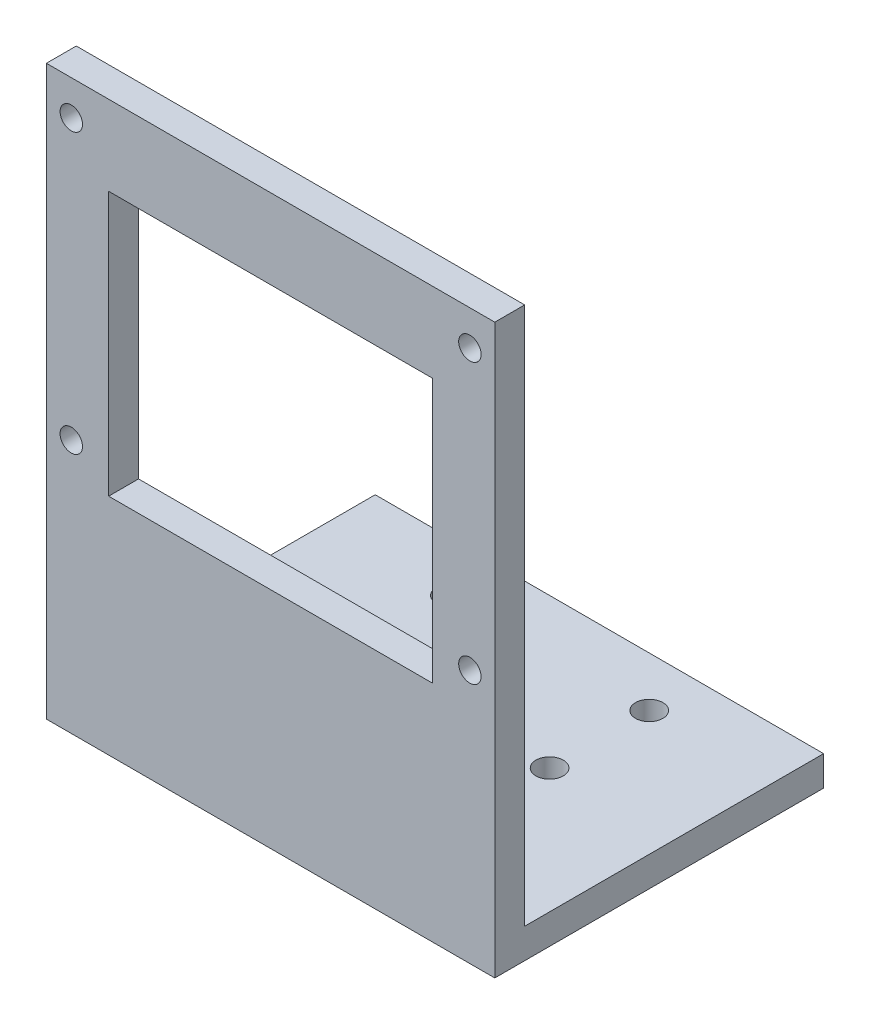
ISO-10303-21;
HEADER;
FILE_DESCRIPTION(('STEP AP214'),'2;1');
FILE_NAME('part.step','',(''),(''),'','','');
FILE_SCHEMA(('AUTOMOTIVE_DESIGN { 1 0 10303 214 1 1 1 1 }'));
ENDSEC;
DATA;
#1=APPLICATION_CONTEXT('core data for automotive mechanical design processes');
#2=APPLICATION_PROTOCOL_DEFINITION('international standard','automotive_design',2000,#1);
#3=PRODUCT_CONTEXT('',#1,'mechanical');
#4=PRODUCT('Part','Part','',(#3));
#5=PRODUCT_RELATED_PRODUCT_CATEGORY('part','',(#4));
#6=PRODUCT_DEFINITION_FORMATION('','',#4);
#7=PRODUCT_DEFINITION_CONTEXT('part definition',#1,'design');
#8=PRODUCT_DEFINITION('design','',#6,#7);
#9=PRODUCT_DEFINITION_SHAPE('','',#8);
#10=(LENGTH_UNIT() NAMED_UNIT(*) SI_UNIT(.MILLI.,.METRE.));
#11=(NAMED_UNIT(*) PLANE_ANGLE_UNIT() SI_UNIT($,.RADIAN.));
#12=(NAMED_UNIT(*) SI_UNIT($,.STERADIAN.) SOLID_ANGLE_UNIT());
#13=UNCERTAINTY_MEASURE_WITH_UNIT(LENGTH_MEASURE(1.E-05),#10,'distance_accuracy_value','');
#14=(GEOMETRIC_REPRESENTATION_CONTEXT(3) GLOBAL_UNCERTAINTY_ASSIGNED_CONTEXT((#13)) GLOBAL_UNIT_ASSIGNED_CONTEXT((#10,
#11,#12)) REPRESENTATION_CONTEXT('',''));
#15=CARTESIAN_POINT('',(0.,0.,0.));
#16=DIRECTION('',(0.,0.,1.));
#17=DIRECTION('',(1.,0.,0.));
#18=AXIS2_PLACEMENT_3D('',#15,#16,#17);
#19=CARTESIAN_POINT('',(25.,0.001899999999978,10.));
#20=DIRECTION('',(0.,1.,0.));
#21=DIRECTION('',(0.,0.,1.));
#22=AXIS2_PLACEMENT_3D('',#19,#20,#21);
#23=CYLINDRICAL_SURFACE('',#22,2.75);
#24=CARTESIAN_POINT('',(25.,0.001899999999978,10.));
#25=DIRECTION('',(0.,1.,0.));
#26=DIRECTION('',(0.,0.,1.));
#27=AXIS2_PLACEMENT_3D('',#24,#25,#26);
#28=CIRCLE('',#27,2.75);
#29=CARTESIAN_POINT('',(25.,0.001899999999978,12.75));
#30=VERTEX_POINT('',#29);
#31=EDGE_CURVE('E120',#30,#30,#28,.F.);
#32=ORIENTED_EDGE('',*,*,#31,.T.);
#33=EDGE_LOOP('',(#32));
#34=FACE_BOUND('',#33,.T.);
#35=CARTESIAN_POINT('',(25.,6.0019,10.));
#36=DIRECTION('',(0.,1.,0.));
#37=DIRECTION('',(0.,0.,1.));
#38=AXIS2_PLACEMENT_3D('',#35,#36,#37);
#39=CIRCLE('',#38,2.75);
#40=CARTESIAN_POINT('',(25.,6.0019,12.75));
#41=VERTEX_POINT('',#40);
#42=EDGE_CURVE('E19',#41,#41,#39,.F.);
#43=ORIENTED_EDGE('',*,*,#42,.F.);
#44=EDGE_LOOP('',(#43));
#45=FACE_BOUND('',#44,.T.);
#46=ADVANCED_FACE('F16',(#34,#45),#23,.F.);
#47=CARTESIAN_POINT('',(25.,0.001899999999978,30.));
#48=DIRECTION('',(0.,1.,0.));
#49=DIRECTION('',(0.,0.,1.));
#50=AXIS2_PLACEMENT_3D('',#47,#48,#49);
#51=CYLINDRICAL_SURFACE('',#50,2.75);
#52=CARTESIAN_POINT('',(25.,0.001899999999978,30.));
#53=DIRECTION('',(0.,1.,0.));
#54=DIRECTION('',(0.,0.,1.));
#55=AXIS2_PLACEMENT_3D('',#52,#53,#54);
#56=CIRCLE('',#55,2.75);
#57=CARTESIAN_POINT('',(25.,0.001899999999978,32.75));
#58=VERTEX_POINT('',#57);
#59=EDGE_CURVE('E155',#58,#58,#56,.F.);
#60=ORIENTED_EDGE('',*,*,#59,.T.);
#61=EDGE_LOOP('',(#60));
#62=FACE_BOUND('',#61,.T.);
#63=CARTESIAN_POINT('',(25.,6.0019,30.));
#64=DIRECTION('',(0.,1.,0.));
#65=DIRECTION('',(0.,0.,1.));
#66=AXIS2_PLACEMENT_3D('',#63,#64,#65);
#67=CIRCLE('',#66,2.75);
#68=CARTESIAN_POINT('',(25.,6.0019,32.75));
#69=VERTEX_POINT('',#68);
#70=EDGE_CURVE('E164',#69,#69,#67,.F.);
#71=ORIENTED_EDGE('',*,*,#70,.F.);
#72=EDGE_LOOP('',(#71));
#73=FACE_BOUND('',#72,.T.);
#74=ADVANCED_FACE('F173',(#62,#73),#51,.F.);
#75=CARTESIAN_POINT('',(65.,0.001899999999978,10.));
#76=DIRECTION('',(0.,1.,0.));
#77=DIRECTION('',(0.,0.,1.));
#78=AXIS2_PLACEMENT_3D('',#75,#76,#77);
#79=CYLINDRICAL_SURFACE('',#78,2.75);
#80=CARTESIAN_POINT('',(65.,0.001899999999978,10.));
#81=DIRECTION('',(0.,1.,0.));
#82=DIRECTION('',(0.,0.,1.));
#83=AXIS2_PLACEMENT_3D('',#80,#81,#82);
#84=CIRCLE('',#83,2.75);
#85=CARTESIAN_POINT('',(65.,0.001899999999978,12.75));
#86=VERTEX_POINT('',#85);
#87=EDGE_CURVE('E152',#86,#86,#84,.F.);
#88=ORIENTED_EDGE('',*,*,#87,.T.);
#89=EDGE_LOOP('',(#88));
#90=FACE_BOUND('',#89,.T.);
#91=CARTESIAN_POINT('',(65.,6.0019,10.));
#92=DIRECTION('',(0.,1.,0.));
#93=DIRECTION('',(0.,0.,1.));
#94=AXIS2_PLACEMENT_3D('',#91,#92,#93);
#95=CIRCLE('',#94,2.75);
#96=CARTESIAN_POINT('',(65.,6.0019,12.75));
#97=VERTEX_POINT('',#96);
#98=EDGE_CURVE('E162',#97,#97,#95,.F.);
#99=ORIENTED_EDGE('',*,*,#98,.F.);
#100=EDGE_LOOP('',(#99));
#101=FACE_BOUND('',#100,.T.);
#102=ADVANCED_FACE('F179',(#90,#101),#79,.F.);
#103=CARTESIAN_POINT('',(65.,0.001899999999978,30.));
#104=DIRECTION('',(0.,1.,0.));
#105=DIRECTION('',(0.,0.,1.));
#106=AXIS2_PLACEMENT_3D('',#103,#104,#105);
#107=CYLINDRICAL_SURFACE('',#106,2.75);
#108=CARTESIAN_POINT('',(65.,0.001899999999978,30.));
#109=DIRECTION('',(0.,1.,0.));
#110=DIRECTION('',(0.,0.,1.));
#111=AXIS2_PLACEMENT_3D('',#108,#109,#110);
#112=CIRCLE('',#111,2.75);
#113=CARTESIAN_POINT('',(65.,0.001899999999978,32.75));
#114=VERTEX_POINT('',#113);
#115=EDGE_CURVE('E148',#114,#114,#112,.F.);
#116=ORIENTED_EDGE('',*,*,#115,.T.);
#117=EDGE_LOOP('',(#116));
#118=FACE_BOUND('',#117,.T.);
#119=CARTESIAN_POINT('',(65.,6.0019,30.));
#120=DIRECTION('',(0.,1.,0.));
#121=DIRECTION('',(0.,0.,1.));
#122=AXIS2_PLACEMENT_3D('',#119,#120,#121);
#123=CIRCLE('',#122,2.75);
#124=CARTESIAN_POINT('',(65.,6.0019,32.75));
#125=VERTEX_POINT('',#124);
#126=EDGE_CURVE('E106',#125,#125,#123,.F.);
#127=ORIENTED_EDGE('',*,*,#126,.F.);
#128=EDGE_LOOP('',(#127));
#129=FACE_BOUND('',#128,.T.);
#130=ADVANCED_FACE('F258',(#118,#129),#107,.F.);
#131=CARTESIAN_POINT('',(0.,0.001899999999978,0.));
#132=DIRECTION('',(0.,0.,1.));
#133=DIRECTION('',(1.,0.,0.));
#134=AXIS2_PLACEMENT_3D('',#131,#132,#133);
#135=PLANE('',#134);
#136=DIRECTION('',(0.,1.,0.));
#137=VECTOR('',#136,1.);
#138=CARTESIAN_POINT('',(90.,0.001899999999978,0.));
#139=LINE('',#138,#137);
#140=CARTESIAN_POINT('',(90.,0.001899999999978,0.));
#141=VERTEX_POINT('',#140);
#142=CARTESIAN_POINT('',(90.,6.0019,0.));
#143=VERTEX_POINT('',#142);
#144=EDGE_CURVE('E151',#141,#143,#139,.T.);
#145=ORIENTED_EDGE('',*,*,#144,.F.);
#146=DIRECTION('',(1.,0.,0.));
#147=VECTOR('',#146,1.);
#148=CARTESIAN_POINT('',(0.,0.001899999999978,0.));
#149=LINE('',#148,#147);
#150=CARTESIAN_POINT('',(0.,0.001899999999978,0.));
#151=VERTEX_POINT('',#150);
#152=EDGE_CURVE('E102',#141,#151,#149,.F.);
#153=ORIENTED_EDGE('',*,*,#152,.T.);
#154=DIRECTION('',(0.,1.,0.));
#155=VECTOR('',#154,1.);
#156=CARTESIAN_POINT('',(0.,0.001899999999978,0.));
#157=LINE('',#156,#155);
#158=CARTESIAN_POINT('',(0.,6.0019,0.));
#159=VERTEX_POINT('',#158);
#160=EDGE_CURVE('E96',#151,#159,#157,.T.);
#161=ORIENTED_EDGE('',*,*,#160,.T.);
#162=DIRECTION('',(1.,0.,0.));
#163=VECTOR('',#162,1.);
#164=CARTESIAN_POINT('',(0.,6.0019,0.));
#165=LINE('',#164,#163);
#166=EDGE_CURVE('E100',#143,#159,#165,.F.);
#167=ORIENTED_EDGE('',*,*,#166,.F.);
#168=EDGE_LOOP('',(#145,#153,#161,#167));
#169=FACE_BOUND('',#168,.T.);
#170=ADVANCED_FACE('F99',(#169),#135,.F.);
#171=CARTESIAN_POINT('',(0.,6.0019,0.));
#172=DIRECTION('',(0.,1.,0.));
#173=DIRECTION('',(0.,0.,1.));
#174=AXIS2_PLACEMENT_3D('',#171,#172,#173);
#175=PLANE('',#174);
#176=ORIENTED_EDGE('',*,*,#126,.T.);
#177=EDGE_LOOP('',(#176));
#178=FACE_BOUND('',#177,.T.);
#179=ORIENTED_EDGE('',*,*,#98,.T.);
#180=EDGE_LOOP('',(#179));
#181=FACE_BOUND('',#180,.T.);
#182=ORIENTED_EDGE('',*,*,#70,.T.);
#183=EDGE_LOOP('',(#182));
#184=FACE_BOUND('',#183,.T.);
#185=ORIENTED_EDGE('',*,*,#42,.T.);
#186=EDGE_LOOP('',(#185));
#187=FACE_BOUND('',#186,.T.);
#188=DIRECTION('',(1.,0.,0.));
#189=VECTOR('',#188,1.);
#190=CARTESIAN_POINT('',(0.,6.0019,60.));
#191=LINE('',#190,#189);
#192=CARTESIAN_POINT('',(0.,6.0019,60.));
#193=VERTEX_POINT('',#192);
#194=CARTESIAN_POINT('',(90.,6.0019,60.));
#195=VERTEX_POINT('',#194);
#196=EDGE_CURVE('E147',#193,#195,#191,.T.);
#197=ORIENTED_EDGE('',*,*,#196,.T.);
#198=DIRECTION('',(0.,0.,-1.));
#199=VECTOR('',#198,1.);
#200=CARTESIAN_POINT('',(90.,6.0019,0.));
#201=LINE('',#200,#199);
#202=EDGE_CURVE('E112',#143,#195,#201,.F.);
#203=ORIENTED_EDGE('',*,*,#202,.F.);
#204=ORIENTED_EDGE('',*,*,#166,.T.);
#205=DIRECTION('',(0.,0.,-1.));
#206=VECTOR('',#205,1.);
#207=CARTESIAN_POINT('',(0.,6.0019,0.));
#208=LINE('',#207,#206);
#209=EDGE_CURVE('E105',#159,#193,#208,.F.);
#210=ORIENTED_EDGE('',*,*,#209,.T.);
#211=EDGE_LOOP('',(#197,#203,#204,#210));
#212=FACE_BOUND('',#211,.T.);
#213=ADVANCED_FACE('F109',(#178,#181,#184,#187,#212),#175,.T.);
#214=CARTESIAN_POINT('',(5.,51.0019,60.000000000116));
#215=DIRECTION('',(0.,0.,-1.));
#216=DIRECTION('',(-1.,0.,0.));
#217=AXIS2_PLACEMENT_3D('',#214,#215,#216);
#218=CONICAL_SURFACE('',#217,4.49999999988904,0.785398163384816);
#219=CARTESIAN_POINT('',(5.,51.0019,60.0000000000023));
#220=DIRECTION('',(0.,0.,-1.));
#221=DIRECTION('',(-1.,0.,0.));
#222=AXIS2_PLACEMENT_3D('',#219,#220,#221);
#223=CIRCLE('',#222,4.50000000000273);
#224=CARTESIAN_POINT('',(0.499999999997272,51.0019,60.0000000000023));
#225=VERTEX_POINT('',#224);
#226=EDGE_CURVE('E144',#225,#225,#223,.T.);
#227=ORIENTED_EDGE('',*,*,#226,.T.);
#228=EDGE_LOOP('',(#227));
#229=FACE_BOUND('',#228,.T.);
#230=CARTESIAN_POINT('',(5.,51.0019,62.25));
#231=DIRECTION('',(0.,0.,1.));
#232=DIRECTION('',(1.,0.,0.));
#233=AXIS2_PLACEMENT_3D('',#230,#231,#232);
#234=CIRCLE('',#233,2.25);
#235=CARTESIAN_POINT('',(7.25,51.0019,62.25));
#236=VERTEX_POINT('',#235);
#237=EDGE_CURVE('E429',#236,#236,#234,.T.);
#238=ORIENTED_EDGE('',*,*,#237,.T.);
#239=EDGE_LOOP('',(#238));
#240=FACE_BOUND('',#239,.T.);
#241=ADVANCED_FACE('F248',(#229,#240),#218,.F.);
#242=CARTESIAN_POINT('',(85.,51.0019,60.0000000000591));
#243=DIRECTION('',(0.,0.,-1.));
#244=DIRECTION('',(0.,1.,0.));
#245=AXIS2_PLACEMENT_3D('',#242,#243,#244);
#246=CONICAL_SURFACE('',#245,4.49999999987312,0.785398163397448);
#247=CARTESIAN_POINT('',(85.,51.0019,59.999999999925));
#248=DIRECTION('',(0.,0.,-1.));
#249=DIRECTION('',(0.,1.,0.));
#250=AXIS2_PLACEMENT_3D('',#247,#248,#249);
#251=CIRCLE('',#250,4.50000000000728);
#252=CARTESIAN_POINT('',(85.,55.5019000000073,59.999999999925));
#253=VERTEX_POINT('',#252);
#254=EDGE_CURVE('E141',#253,#253,#251,.T.);
#255=ORIENTED_EDGE('',*,*,#254,.T.);
#256=EDGE_LOOP('',(#255));
#257=FACE_BOUND('',#256,.T.);
#258=CARTESIAN_POINT('',(85.,51.0019,62.25));
#259=DIRECTION('',(0.,0.,1.));
#260=DIRECTION('',(1.,0.,0.));
#261=AXIS2_PLACEMENT_3D('',#258,#259,#260);
#262=CIRCLE('',#261,2.25);
#263=CARTESIAN_POINT('',(87.25,51.0019,62.25));
#264=VERTEX_POINT('',#263);
#265=EDGE_CURVE('E431',#264,#264,#262,.T.);
#266=ORIENTED_EDGE('',*,*,#265,.T.);
#267=EDGE_LOOP('',(#266));
#268=FACE_BOUND('',#267,.T.);
#269=ADVANCED_FACE('F244',(#257,#268),#246,.F.);
#270=CARTESIAN_POINT('',(0.,0.001899999999978,60.));
#271=DIRECTION('',(0.,0.,1.));
#272=DIRECTION('',(1.,0.,0.));
#273=AXIS2_PLACEMENT_3D('',#270,#271,#272);
#274=PLANE('',#273);
#275=CARTESIAN_POINT('',(85.,107.0019,59.999999999925));
#276=DIRECTION('',(0.,0.,-1.));
#277=DIRECTION('',(0.,1.,0.));
#278=AXIS2_PLACEMENT_3D('',#275,#276,#277);
#279=CIRCLE('',#278,4.50000000000728);
#280=CARTESIAN_POINT('',(85.,111.501900000007,59.999999999925));
#281=VERTEX_POINT('',#280);
#282=EDGE_CURVE('E135',#281,#281,#279,.F.);
#283=ORIENTED_EDGE('',*,*,#282,.T.);
#284=EDGE_LOOP('',(#283));
#285=FACE_BOUND('',#284,.T.);
#286=CARTESIAN_POINT('',(5.,107.0019,60.0000000000023));
#287=DIRECTION('',(0.,0.,-1.));
#288=DIRECTION('',(-1.,0.,0.));
#289=AXIS2_PLACEMENT_3D('',#286,#287,#288);
#290=CIRCLE('',#289,4.50000000000273);
#291=CARTESIAN_POINT('',(0.499999999997272,107.0019,60.0000000000023));
#292=VERTEX_POINT('',#291);
#293=EDGE_CURVE('E138',#292,#292,#290,.F.);
#294=ORIENTED_EDGE('',*,*,#293,.T.);
#295=EDGE_LOOP('',(#294));
#296=FACE_BOUND('',#295,.T.);
#297=DIRECTION('',(0.,1.,0.));
#298=VECTOR('',#297,1.);
#299=CARTESIAN_POINT('',(77.5,45.0019,60.));
#300=LINE('',#299,#298);
#301=CARTESIAN_POINT('',(77.5,45.0019,60.));
#302=VERTEX_POINT('',#301);
#303=CARTESIAN_POINT('',(77.5,98.0019,60.));
#304=VERTEX_POINT('',#303);
#305=EDGE_CURVE('E485',#302,#304,#300,.T.);
#306=ORIENTED_EDGE('',*,*,#305,.T.);
#307=DIRECTION('',(1.,0.,0.));
#308=VECTOR('',#307,1.);
#309=CARTESIAN_POINT('',(12.5,98.0019,60.));
#310=LINE('',#309,#308);
#311=CARTESIAN_POINT('',(12.5,98.0019,60.));
#312=VERTEX_POINT('',#311);
#313=EDGE_CURVE('E489',#304,#312,#310,.F.);
#314=ORIENTED_EDGE('',*,*,#313,.T.);
#315=DIRECTION('',(0.,1.,0.));
#316=VECTOR('',#315,1.);
#317=CARTESIAN_POINT('',(12.5,45.0019,60.));
#318=LINE('',#317,#316);
#319=CARTESIAN_POINT('',(12.5,45.0019,60.));
#320=VERTEX_POINT('',#319);
#321=EDGE_CURVE('E435',#320,#312,#318,.T.);
#322=ORIENTED_EDGE('',*,*,#321,.F.);
#323=DIRECTION('',(1.,0.,0.));
#324=VECTOR('',#323,1.);
#325=CARTESIAN_POINT('',(12.5,45.0019,60.));
#326=LINE('',#325,#324);
#327=EDGE_CURVE('E480',#302,#320,#326,.F.);
#328=ORIENTED_EDGE('',*,*,#327,.F.);
#329=EDGE_LOOP('',(#306,#314,#322,#328));
#330=FACE_BOUND('',#329,.T.);
#331=ORIENTED_EDGE('',*,*,#254,.F.);
#332=EDGE_LOOP('',(#331));
#333=FACE_BOUND('',#332,.T.);
#334=ORIENTED_EDGE('',*,*,#226,.F.);
#335=EDGE_LOOP('',(#334));
#336=FACE_BOUND('',#335,.T.);
#337=DIRECTION('',(0.,1.,0.));
#338=VECTOR('',#337,1.);
#339=CARTESIAN_POINT('',(90.,0.001899999999978,60.));
#340=LINE('',#339,#338);
#341=CARTESIAN_POINT('',(90.,114.0019,60.));
#342=VERTEX_POINT('',#341);
#343=EDGE_CURVE('E447',#195,#342,#340,.T.);
#344=ORIENTED_EDGE('',*,*,#343,.F.);
#345=ORIENTED_EDGE('',*,*,#196,.F.);
#346=DIRECTION('',(0.,1.,0.));
#347=VECTOR('',#346,1.);
#348=CARTESIAN_POINT('',(0.,0.001899999999978,60.));
#349=LINE('',#348,#347);
#350=CARTESIAN_POINT('',(0.,114.0019,60.));
#351=VERTEX_POINT('',#350);
#352=EDGE_CURVE('E118',#193,#351,#349,.T.);
#353=ORIENTED_EDGE('',*,*,#352,.T.);
#354=DIRECTION('',(1.,0.,0.));
#355=VECTOR('',#354,1.);
#356=CARTESIAN_POINT('',(0.,114.0019,60.));
#357=LINE('',#356,#355);
#358=EDGE_CURVE('E444',#342,#351,#357,.F.);
#359=ORIENTED_EDGE('',*,*,#358,.F.);
#360=EDGE_LOOP('',(#344,#345,#353,#359));
#361=FACE_BOUND('',#360,.T.);
#362=ADVANCED_FACE('F240',(#285,#296,#330,#333,#336,#361),#274,.F.);
#363=CARTESIAN_POINT('',(5.,107.0019,60.000000000116));
#364=DIRECTION('',(0.,0.,-1.));
#365=DIRECTION('',(-1.,0.,0.));
#366=AXIS2_PLACEMENT_3D('',#363,#364,#365);
#367=CONICAL_SURFACE('',#366,4.49999999988904,0.785398163384816);
#368=ORIENTED_EDGE('',*,*,#293,.F.);
#369=EDGE_LOOP('',(#368));
#370=FACE_BOUND('',#369,.T.);
#371=CARTESIAN_POINT('',(5.,107.0019,62.25));
#372=DIRECTION('',(0.,0.,1.));
#373=DIRECTION('',(1.,0.,0.));
#374=AXIS2_PLACEMENT_3D('',#371,#372,#373);
#375=CIRCLE('',#374,2.25);
#376=CARTESIAN_POINT('',(7.25,107.0019,62.25));
#377=VERTEX_POINT('',#376);
#378=EDGE_CURVE('E470',#377,#377,#375,.T.);
#379=ORIENTED_EDGE('',*,*,#378,.T.);
#380=EDGE_LOOP('',(#379));
#381=FACE_BOUND('',#380,.T.);
#382=ADVANCED_FACE('F236',(#370,#381),#367,.F.);
#383=CARTESIAN_POINT('',(85.,107.0019,60.0000000000591));
#384=DIRECTION('',(0.,0.,-1.));
#385=DIRECTION('',(0.,1.,0.));
#386=AXIS2_PLACEMENT_3D('',#383,#384,#385);
#387=CONICAL_SURFACE('',#386,4.49999999987312,0.785398163397448);
#388=ORIENTED_EDGE('',*,*,#282,.F.);
#389=EDGE_LOOP('',(#388));
#390=FACE_BOUND('',#389,.T.);
#391=CARTESIAN_POINT('',(85.,107.0019,62.25));
#392=DIRECTION('',(0.,0.,1.));
#393=DIRECTION('',(1.,0.,0.));
#394=AXIS2_PLACEMENT_3D('',#391,#392,#393);
#395=CIRCLE('',#394,2.25);
#396=CARTESIAN_POINT('',(87.25,107.0019,62.25));
#397=VERTEX_POINT('',#396);
#398=EDGE_CURVE('E467',#397,#397,#395,.T.);
#399=ORIENTED_EDGE('',*,*,#398,.T.);
#400=EDGE_LOOP('',(#399));
#401=FACE_BOUND('',#400,.T.);
#402=ADVANCED_FACE('F233',(#390,#401),#387,.F.);
#403=CARTESIAN_POINT('',(0.,0.001899999999978,60.));
#404=DIRECTION('',(1.,0.,0.));
#405=DIRECTION('',(0.,0.,-1.));
#406=AXIS2_PLACEMENT_3D('',#403,#404,#405);
#407=PLANE('',#406);
#408=DIRECTION('',(0.,0.,1.));
#409=VECTOR('',#408,1.);
#410=CARTESIAN_POINT('',(0.,114.0019,60.));
#411=LINE('',#410,#409);
#412=CARTESIAN_POINT('',(0.,114.0019,66.));
#413=VERTEX_POINT('',#412);
#414=EDGE_CURVE('E438',#351,#413,#411,.T.);
#415=ORIENTED_EDGE('',*,*,#414,.F.);
#416=ORIENTED_EDGE('',*,*,#352,.F.);
#417=ORIENTED_EDGE('',*,*,#209,.F.);
#418=ORIENTED_EDGE('',*,*,#160,.F.);
#419=DIRECTION('',(0.,0.,1.));
#420=VECTOR('',#419,1.);
#421=CARTESIAN_POINT('',(0.,0.001899999999978,60.));
#422=LINE('',#421,#420);
#423=CARTESIAN_POINT('',(0.,0.001899999999978,66.));
#424=VERTEX_POINT('',#423);
#425=EDGE_CURVE('E91',#151,#424,#422,.T.);
#426=ORIENTED_EDGE('',*,*,#425,.T.);
#427=DIRECTION('',(0.,1.,0.));
#428=VECTOR('',#427,1.);
#429=CARTESIAN_POINT('',(0.,0.001899999999978,66.));
#430=LINE('',#429,#428);
#431=EDGE_CURVE('E463',#413,#424,#430,.F.);
#432=ORIENTED_EDGE('',*,*,#431,.F.);
#433=EDGE_LOOP('',(#415,#416,#417,#418,#426,#432));
#434=FACE_BOUND('',#433,.T.);
#435=ADVANCED_FACE('F117',(#434),#407,.F.);
#436=CARTESIAN_POINT('',(0.,0.001899999999978,60.));
#437=DIRECTION('',(0.,1.,0.));
#438=DIRECTION('',(0.,0.,1.));
#439=AXIS2_PLACEMENT_3D('',#436,#437,#438);
#440=PLANE('',#439);
#441=DIRECTION('',(1.,0.,0.));
#442=VECTOR('',#441,1.);
#443=CARTESIAN_POINT('',(0.,0.001899999999978,66.));
#444=LINE('',#443,#442);
#445=CARTESIAN_POINT('',(90.,0.001899999999978,66.));
#446=VERTEX_POINT('',#445);
#447=EDGE_CURVE('E460',#424,#446,#444,.T.);
#448=ORIENTED_EDGE('',*,*,#447,.F.);
#449=ORIENTED_EDGE('',*,*,#425,.F.);
#450=ORIENTED_EDGE('',*,*,#152,.F.);
#451=DIRECTION('',(0.,0.,-1.));
#452=VECTOR('',#451,1.);
#453=CARTESIAN_POINT('',(90.,0.001899999999978,60.));
#454=LINE('',#453,#452);
#455=EDGE_CURVE('E450',#446,#141,#454,.T.);
#456=ORIENTED_EDGE('',*,*,#455,.F.);
#457=EDGE_LOOP('',(#448,#449,#450,#456));
#458=FACE_BOUND('',#457,.T.);
#459=ORIENTED_EDGE('',*,*,#115,.F.);
#460=EDGE_LOOP('',(#459));
#461=FACE_BOUND('',#460,.T.);
#462=ORIENTED_EDGE('',*,*,#87,.F.);
#463=EDGE_LOOP('',(#462));
#464=FACE_BOUND('',#463,.T.);
#465=ORIENTED_EDGE('',*,*,#59,.F.);
#466=EDGE_LOOP('',(#465));
#467=FACE_BOUND('',#466,.T.);
#468=ORIENTED_EDGE('',*,*,#31,.F.);
#469=EDGE_LOOP('',(#468));
#470=FACE_BOUND('',#469,.T.);
#471=ADVANCED_FACE('F227',(#458,#461,#464,#467,#470),#440,.F.);
#472=CARTESIAN_POINT('',(90.,0.001899999999978,60.));
#473=DIRECTION('',(1.,0.,0.));
#474=DIRECTION('',(0.,0.,-1.));
#475=AXIS2_PLACEMENT_3D('',#472,#473,#474);
#476=PLANE('',#475);
#477=DIRECTION('',(0.,0.,1.));
#478=VECTOR('',#477,1.);
#479=CARTESIAN_POINT('',(90.,114.0019,60.));
#480=LINE('',#479,#478);
#481=CARTESIAN_POINT('',(90.,114.0019,66.));
#482=VERTEX_POINT('',#481);
#483=EDGE_CURVE('E432',#482,#342,#480,.F.);
#484=ORIENTED_EDGE('',*,*,#483,.F.);
#485=DIRECTION('',(0.,1.,0.));
#486=VECTOR('',#485,1.);
#487=CARTESIAN_POINT('',(90.,0.001899999999978,66.));
#488=LINE('',#487,#486);
#489=EDGE_CURVE('E458',#446,#482,#488,.T.);
#490=ORIENTED_EDGE('',*,*,#489,.F.);
#491=ORIENTED_EDGE('',*,*,#455,.T.);
#492=ORIENTED_EDGE('',*,*,#144,.T.);
#493=ORIENTED_EDGE('',*,*,#202,.T.);
#494=ORIENTED_EDGE('',*,*,#343,.T.);
#495=EDGE_LOOP('',(#484,#490,#491,#492,#493,#494));
#496=FACE_BOUND('',#495,.T.);
#497=ADVANCED_FACE('F223',(#496),#476,.T.);
#498=CARTESIAN_POINT('',(0.,114.0019,60.));
#499=DIRECTION('',(0.,1.,0.));
#500=DIRECTION('',(0.,0.,1.));
#501=AXIS2_PLACEMENT_3D('',#498,#499,#500);
#502=PLANE('',#501);
#503=DIRECTION('',(1.,0.,0.));
#504=VECTOR('',#503,1.);
#505=CARTESIAN_POINT('',(0.,114.0019,66.));
#506=LINE('',#505,#504);
#507=EDGE_CURVE('E134',#482,#413,#506,.F.);
#508=ORIENTED_EDGE('',*,*,#507,.F.);
#509=ORIENTED_EDGE('',*,*,#483,.T.);
#510=ORIENTED_EDGE('',*,*,#358,.T.);
#511=ORIENTED_EDGE('',*,*,#414,.T.);
#512=EDGE_LOOP('',(#508,#509,#510,#511));
#513=FACE_BOUND('',#512,.T.);
#514=ADVANCED_FACE('F219',(#513),#502,.T.);
#515=CARTESIAN_POINT('',(5.,51.0019,60.));
#516=DIRECTION('',(0.,0.,1.));
#517=DIRECTION('',(1.,0.,0.));
#518=AXIS2_PLACEMENT_3D('',#515,#516,#517);
#519=CYLINDRICAL_SURFACE('',#518,2.25);
#520=CARTESIAN_POINT('',(5.,51.0019,66.));
#521=DIRECTION('',(0.,0.,1.));
#522=DIRECTION('',(1.,0.,0.));
#523=AXIS2_PLACEMENT_3D('',#520,#521,#522);
#524=CIRCLE('',#523,2.25);
#525=CARTESIAN_POINT('',(7.25,51.0019,66.));
#526=VERTEX_POINT('',#525);
#527=EDGE_CURVE('E131',#526,#526,#524,.F.);
#528=ORIENTED_EDGE('',*,*,#527,.F.);
#529=EDGE_LOOP('',(#528));
#530=FACE_BOUND('',#529,.T.);
#531=ORIENTED_EDGE('',*,*,#237,.F.);
#532=EDGE_LOOP('',(#531));
#533=FACE_BOUND('',#532,.T.);
#534=ADVANCED_FACE('F215',(#530,#533),#519,.F.);
#535=CARTESIAN_POINT('',(85.,51.0019,60.));
#536=DIRECTION('',(0.,0.,1.));
#537=DIRECTION('',(1.,0.,0.));
#538=AXIS2_PLACEMENT_3D('',#535,#536,#537);
#539=CYLINDRICAL_SURFACE('',#538,2.25);
#540=CARTESIAN_POINT('',(85.,51.0019,66.));
#541=DIRECTION('',(0.,0.,1.));
#542=DIRECTION('',(1.,0.,0.));
#543=AXIS2_PLACEMENT_3D('',#540,#541,#542);
#544=CIRCLE('',#543,2.25);
#545=CARTESIAN_POINT('',(87.25,51.0019,66.));
#546=VERTEX_POINT('',#545);
#547=EDGE_CURVE('E127',#546,#546,#544,.F.);
#548=ORIENTED_EDGE('',*,*,#547,.F.);
#549=EDGE_LOOP('',(#548));
#550=FACE_BOUND('',#549,.T.);
#551=ORIENTED_EDGE('',*,*,#265,.F.);
#552=EDGE_LOOP('',(#551));
#553=FACE_BOUND('',#552,.T.);
#554=ADVANCED_FACE('F211',(#550,#553),#539,.F.);
#555=CARTESIAN_POINT('',(12.5,45.0019,60.));
#556=DIRECTION('',(1.,0.,0.));
#557=DIRECTION('',(0.,0.,-1.));
#558=AXIS2_PLACEMENT_3D('',#555,#556,#557);
#559=PLANE('',#558);
#560=DIRECTION('',(0.,0.,1.));
#561=VECTOR('',#560,1.);
#562=CARTESIAN_POINT('',(12.5,98.0019,60.));
#563=LINE('',#562,#561);
#564=CARTESIAN_POINT('',(12.5,98.0019,66.));
#565=VERTEX_POINT('',#564);
#566=EDGE_CURVE('E487',#312,#565,#563,.T.);
#567=ORIENTED_EDGE('',*,*,#566,.T.);
#568=DIRECTION('',(0.,1.,0.));
#569=VECTOR('',#568,1.);
#570=CARTESIAN_POINT('',(12.5,0.001899999999978,66.));
#571=LINE('',#570,#569);
#572=CARTESIAN_POINT('',(12.5,45.0019,66.));
#573=VERTEX_POINT('',#572);
#574=EDGE_CURVE('E130',#573,#565,#571,.T.);
#575=ORIENTED_EDGE('',*,*,#574,.F.);
#576=DIRECTION('',(0.,0.,1.));
#577=VECTOR('',#576,1.);
#578=CARTESIAN_POINT('',(12.5,45.0019,60.));
#579=LINE('',#578,#577);
#580=EDGE_CURVE('E477',#320,#573,#579,.T.);
#581=ORIENTED_EDGE('',*,*,#580,.F.);
#582=ORIENTED_EDGE('',*,*,#321,.T.);
#583=EDGE_LOOP('',(#567,#575,#581,#582));
#584=FACE_BOUND('',#583,.T.);
#585=ADVANCED_FACE('F207',(#584),#559,.T.);
#586=CARTESIAN_POINT('',(12.5,98.0019,60.));
#587=DIRECTION('',(0.,1.,0.));
#588=DIRECTION('',(0.,0.,1.));
#589=AXIS2_PLACEMENT_3D('',#586,#587,#588);
#590=PLANE('',#589);
#591=DIRECTION('',(1.,0.,0.));
#592=VECTOR('',#591,1.);
#593=CARTESIAN_POINT('',(0.,98.0019,66.));
#594=LINE('',#593,#592);
#595=CARTESIAN_POINT('',(77.5,98.0019,66.));
#596=VERTEX_POINT('',#595);
#597=EDGE_CURVE('E498',#565,#596,#594,.T.);
#598=ORIENTED_EDGE('',*,*,#597,.F.);
#599=ORIENTED_EDGE('',*,*,#566,.F.);
#600=ORIENTED_EDGE('',*,*,#313,.F.);
#601=DIRECTION('',(0.,0.,-1.));
#602=VECTOR('',#601,1.);
#603=CARTESIAN_POINT('',(77.5,98.0019,60.));
#604=LINE('',#603,#602);
#605=EDGE_CURVE('E483',#304,#596,#604,.F.);
#606=ORIENTED_EDGE('',*,*,#605,.T.);
#607=EDGE_LOOP('',(#598,#599,#600,#606));
#608=FACE_BOUND('',#607,.T.);
#609=ADVANCED_FACE('F204',(#608),#590,.F.);
#610=CARTESIAN_POINT('',(77.5,45.0019,60.));
#611=DIRECTION('',(1.,0.,0.));
#612=DIRECTION('',(0.,0.,-1.));
#613=AXIS2_PLACEMENT_3D('',#610,#611,#612);
#614=PLANE('',#613);
#615=ORIENTED_EDGE('',*,*,#605,.F.);
#616=ORIENTED_EDGE('',*,*,#305,.F.);
#617=DIRECTION('',(0.,0.,1.));
#618=VECTOR('',#617,1.);
#619=CARTESIAN_POINT('',(77.5,45.0019,60.));
#620=LINE('',#619,#618);
#621=CARTESIAN_POINT('',(77.5,45.0019,66.));
#622=VERTEX_POINT('',#621);
#623=EDGE_CURVE('E34',#622,#302,#620,.F.);
#624=ORIENTED_EDGE('',*,*,#623,.F.);
#625=DIRECTION('',(0.,1.,0.));
#626=VECTOR('',#625,1.);
#627=CARTESIAN_POINT('',(77.5,0.001899999999978,66.));
#628=LINE('',#627,#626);
#629=EDGE_CURVE('E502',#596,#622,#628,.F.);
#630=ORIENTED_EDGE('',*,*,#629,.F.);
#631=EDGE_LOOP('',(#615,#616,#624,#630));
#632=FACE_BOUND('',#631,.T.);
#633=ADVANCED_FACE('F200',(#632),#614,.F.);
#634=CARTESIAN_POINT('',(12.5,45.0019,60.));
#635=DIRECTION('',(0.,1.,0.));
#636=DIRECTION('',(0.,0.,1.));
#637=AXIS2_PLACEMENT_3D('',#634,#635,#636);
#638=PLANE('',#637);
#639=DIRECTION('',(1.,0.,0.));
#640=VECTOR('',#639,1.);
#641=CARTESIAN_POINT('',(0.,45.0019,66.));
#642=LINE('',#641,#640);
#643=EDGE_CURVE('E126',#622,#573,#642,.F.);
#644=ORIENTED_EDGE('',*,*,#643,.F.);
#645=ORIENTED_EDGE('',*,*,#623,.T.);
#646=ORIENTED_EDGE('',*,*,#327,.T.);
#647=ORIENTED_EDGE('',*,*,#580,.T.);
#648=EDGE_LOOP('',(#644,#645,#646,#647));
#649=FACE_BOUND('',#648,.T.);
#650=ADVANCED_FACE('F196',(#649),#638,.T.);
#651=CARTESIAN_POINT('',(5.,107.0019,60.));
#652=DIRECTION('',(0.,0.,1.));
#653=DIRECTION('',(1.,0.,0.));
#654=AXIS2_PLACEMENT_3D('',#651,#652,#653);
#655=CYLINDRICAL_SURFACE('',#654,2.25);
#656=CARTESIAN_POINT('',(5.,107.0019,66.));
#657=DIRECTION('',(0.,0.,1.));
#658=DIRECTION('',(1.,0.,0.));
#659=AXIS2_PLACEMENT_3D('',#656,#657,#658);
#660=CIRCLE('',#659,2.25);
#661=CARTESIAN_POINT('',(7.25,107.0019,66.));
#662=VERTEX_POINT('',#661);
#663=EDGE_CURVE('E25',#662,#662,#660,.F.);
#664=ORIENTED_EDGE('',*,*,#663,.F.);
#665=EDGE_LOOP('',(#664));
#666=FACE_BOUND('',#665,.T.);
#667=ORIENTED_EDGE('',*,*,#378,.F.);
#668=EDGE_LOOP('',(#667));
#669=FACE_BOUND('',#668,.T.);
#670=ADVANCED_FACE('F189',(#666,#669),#655,.F.);
#671=CARTESIAN_POINT('',(85.,107.0019,60.));
#672=DIRECTION('',(0.,0.,1.));
#673=DIRECTION('',(1.,0.,0.));
#674=AXIS2_PLACEMENT_3D('',#671,#672,#673);
#675=CYLINDRICAL_SURFACE('',#674,2.25);
#676=CARTESIAN_POINT('',(85.,107.0019,66.));
#677=DIRECTION('',(0.,0.,1.));
#678=DIRECTION('',(1.,0.,0.));
#679=AXIS2_PLACEMENT_3D('',#676,#677,#678);
#680=CIRCLE('',#679,2.25);
#681=CARTESIAN_POINT('',(87.25,107.0019,66.));
#682=VERTEX_POINT('',#681);
#683=EDGE_CURVE('E11',#682,#682,#680,.F.);
#684=ORIENTED_EDGE('',*,*,#683,.F.);
#685=EDGE_LOOP('',(#684));
#686=FACE_BOUND('',#685,.T.);
#687=ORIENTED_EDGE('',*,*,#398,.F.);
#688=EDGE_LOOP('',(#687));
#689=FACE_BOUND('',#688,.T.);
#690=ADVANCED_FACE('F183',(#686,#689),#675,.F.);
#691=CARTESIAN_POINT('',(0.,0.001899999999978,66.));
#692=DIRECTION('',(0.,0.,1.));
#693=DIRECTION('',(1.,0.,0.));
#694=AXIS2_PLACEMENT_3D('',#691,#692,#693);
#695=PLANE('',#694);
#696=ORIENTED_EDGE('',*,*,#683,.T.);
#697=EDGE_LOOP('',(#696));
#698=FACE_BOUND('',#697,.T.);
#699=ORIENTED_EDGE('',*,*,#663,.T.);
#700=EDGE_LOOP('',(#699));
#701=FACE_BOUND('',#700,.T.);
#702=ORIENTED_EDGE('',*,*,#629,.T.);
#703=ORIENTED_EDGE('',*,*,#643,.T.);
#704=ORIENTED_EDGE('',*,*,#574,.T.);
#705=ORIENTED_EDGE('',*,*,#597,.T.);
#706=EDGE_LOOP('',(#702,#703,#704,#705));
#707=FACE_BOUND('',#706,.T.);
#708=ORIENTED_EDGE('',*,*,#547,.T.);
#709=EDGE_LOOP('',(#708));
#710=FACE_BOUND('',#709,.T.);
#711=ORIENTED_EDGE('',*,*,#527,.T.);
#712=EDGE_LOOP('',(#711));
#713=FACE_BOUND('',#712,.T.);
#714=ORIENTED_EDGE('',*,*,#489,.T.);
#715=ORIENTED_EDGE('',*,*,#507,.T.);
#716=ORIENTED_EDGE('',*,*,#431,.T.);
#717=ORIENTED_EDGE('',*,*,#447,.T.);
#718=EDGE_LOOP('',(#714,#715,#716,#717));
#719=FACE_BOUND('',#718,.T.);
#720=ADVANCED_FACE('F181',(#698,#701,#707,#710,#713,#719),#695,.T.);
#721=CLOSED_SHELL('',(#46,#74,#102,#130,#170,#213,#241,#269,#362,#382,#402,#435,#471,#497,#514,
#534,#554,#585,#609,#633,#650,#670,#690,#720));
#722=MANIFOLD_SOLID_BREP('B1',#721);
#723=ADVANCED_BREP_SHAPE_REPRESENTATION('',(#18,#722),#14);
#724=SHAPE_DEFINITION_REPRESENTATION(#9,#723);
ENDSEC;
END-ISO-10303-21;
